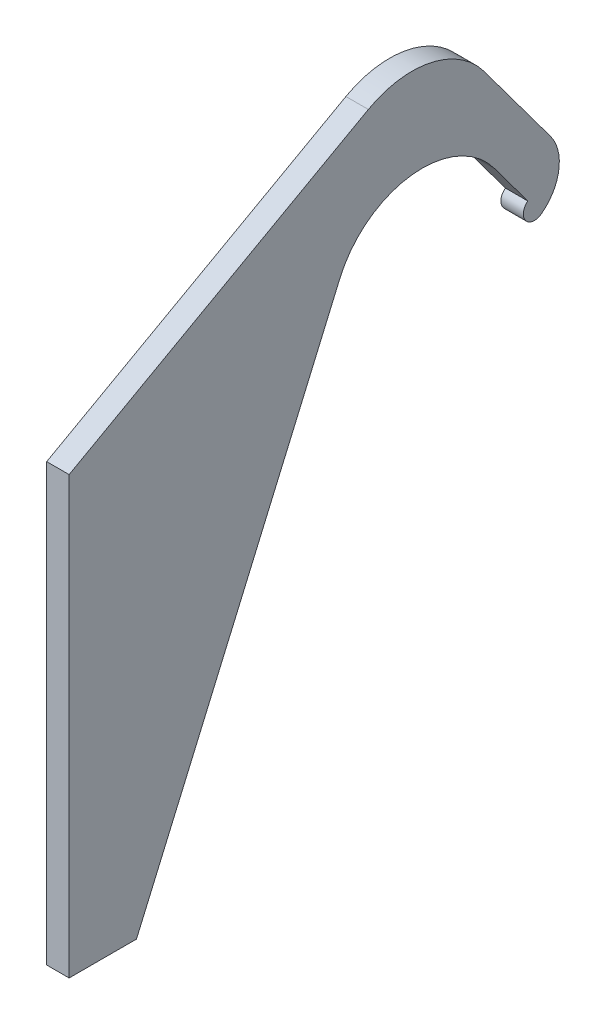
ISO-10303-21;
HEADER;
FILE_DESCRIPTION(('STEP AP214'),'2;1');
FILE_NAME('part.step','',(''),(''),'','','');
FILE_SCHEMA(('AUTOMOTIVE_DESIGN { 1 0 10303 214 1 1 1 1 }'));
ENDSEC;
DATA;
#1=APPLICATION_CONTEXT('core data for automotive mechanical design processes');
#2=APPLICATION_PROTOCOL_DEFINITION('international standard','automotive_design',2000,#1);
#3=PRODUCT_CONTEXT('',#1,'mechanical');
#4=PRODUCT('Part','Part','',(#3));
#5=PRODUCT_RELATED_PRODUCT_CATEGORY('part','',(#4));
#6=PRODUCT_DEFINITION_FORMATION('','',#4);
#7=PRODUCT_DEFINITION_CONTEXT('part definition',#1,'design');
#8=PRODUCT_DEFINITION('design','',#6,#7);
#9=PRODUCT_DEFINITION_SHAPE('','',#8);
#10=(LENGTH_UNIT() NAMED_UNIT(*) SI_UNIT(.MILLI.,.METRE.));
#11=(NAMED_UNIT(*) PLANE_ANGLE_UNIT() SI_UNIT($,.RADIAN.));
#12=(NAMED_UNIT(*) SI_UNIT($,.STERADIAN.) SOLID_ANGLE_UNIT());
#13=UNCERTAINTY_MEASURE_WITH_UNIT(LENGTH_MEASURE(1.E-05),#10,'distance_accuracy_value','');
#14=(GEOMETRIC_REPRESENTATION_CONTEXT(3) GLOBAL_UNCERTAINTY_ASSIGNED_CONTEXT((#13)) GLOBAL_UNIT_ASSIGNED_CONTEXT((#10,
#11,#12)) REPRESENTATION_CONTEXT('',''));
#15=CARTESIAN_POINT('',(0.,0.,0.));
#16=DIRECTION('',(0.,0.,1.));
#17=DIRECTION('',(1.,0.,0.));
#18=AXIS2_PLACEMENT_3D('',#15,#16,#17);
#19=CARTESIAN_POINT('',(3.175,61.6912472529356,0.));
#20=DIRECTION('',(0.,0.,-1.));
#21=DIRECTION('',(-1.,0.,0.));
#22=AXIS2_PLACEMENT_3D('',#19,#20,#21);
#23=PLANE('',#22);
#24=DIRECTION('',(0.,-1.,0.));
#25=VECTOR('',#24,1.);
#26=CARTESIAN_POINT('',(0.,61.6912472529356,0.));
#27=LINE('',#26,#25);
#28=CARTESIAN_POINT('',(0.,61.6912472529356,0.));
#29=VERTEX_POINT('',#28);
#30=CARTESIAN_POINT('',(0.,0.,0.));
#31=VERTEX_POINT('',#30);
#32=EDGE_CURVE('E147',#29,#31,#27,.T.);
#33=ORIENTED_EDGE('',*,*,#32,.T.);
#34=DIRECTION('',(-1.,0.,0.));
#35=VECTOR('',#34,1.);
#36=CARTESIAN_POINT('',(3.175,0.,0.));
#37=LINE('',#36,#35);
#38=CARTESIAN_POINT('',(3.175,0.,0.));
#39=VERTEX_POINT('',#38);
#40=EDGE_CURVE('E11',#39,#31,#37,.T.);
#41=ORIENTED_EDGE('',*,*,#40,.F.);
#42=DIRECTION('',(0.,-1.,0.));
#43=VECTOR('',#42,1.);
#44=CARTESIAN_POINT('',(3.175,61.6912472529356,0.));
#45=LINE('',#44,#43);
#46=CARTESIAN_POINT('',(3.175,61.6912472529356,0.));
#47=VERTEX_POINT('',#46);
#48=EDGE_CURVE('E165',#47,#39,#45,.T.);
#49=ORIENTED_EDGE('',*,*,#48,.F.);
#50=DIRECTION('',(-1.,0.,0.));
#51=VECTOR('',#50,1.);
#52=CARTESIAN_POINT('',(3.175,61.6912472529356,0.));
#53=LINE('',#52,#51);
#54=EDGE_CURVE('E143',#47,#29,#53,.T.);
#55=ORIENTED_EDGE('',*,*,#54,.T.);
#56=EDGE_LOOP('',(#33,#41,#49,#55));
#57=FACE_BOUND('',#56,.T.);
#58=ADVANCED_FACE('F39',(#57),#23,.F.);
#59=CARTESIAN_POINT('',(3.175,0.,0.));
#60=DIRECTION('',(0.,1.,0.));
#61=DIRECTION('',(0.,0.,1.));
#62=AXIS2_PLACEMENT_3D('',#59,#60,#61);
#63=PLANE('',#62);
#64=DIRECTION('',(0.,0.,-1.));
#65=VECTOR('',#64,1.);
#66=CARTESIAN_POINT('',(0.,0.,0.));
#67=LINE('',#66,#65);
#68=CARTESIAN_POINT('',(0.,0.,-9.525));
#69=VERTEX_POINT('',#68);
#70=EDGE_CURVE('E150',#31,#69,#67,.T.);
#71=ORIENTED_EDGE('',*,*,#70,.T.);
#72=DIRECTION('',(-1.,0.,0.));
#73=VECTOR('',#72,1.);
#74=CARTESIAN_POINT('',(3.175,0.,-9.525));
#75=LINE('',#74,#73);
#76=CARTESIAN_POINT('',(3.175,0.,-9.525));
#77=VERTEX_POINT('',#76);
#78=EDGE_CURVE('E47',#77,#69,#75,.T.);
#79=ORIENTED_EDGE('',*,*,#78,.F.);
#80=DIRECTION('',(0.,0.,-1.));
#81=VECTOR('',#80,1.);
#82=CARTESIAN_POINT('',(3.175,0.,0.));
#83=LINE('',#82,#81);
#84=EDGE_CURVE('E104',#39,#77,#83,.T.);
#85=ORIENTED_EDGE('',*,*,#84,.F.);
#86=ORIENTED_EDGE('',*,*,#40,.T.);
#87=EDGE_LOOP('',(#71,#79,#85,#86));
#88=FACE_BOUND('',#87,.T.);
#89=ADVANCED_FACE('F214',(#88),#63,.F.);
#90=CARTESIAN_POINT('',(3.175,0.,-9.525));
#91=DIRECTION('',(0.,0.396901047345091,0.917861404906193));
#92=DIRECTION('',(0.,-0.917861404906193,0.396901047345091));
#93=AXIS2_PLACEMENT_3D('',#90,#91,#92);
#94=PLANE('',#93);
#95=DIRECTION('',(0.,0.917861404906193,-0.396901047345091));
#96=VECTOR('',#95,1.);
#97=CARTESIAN_POINT('',(0.,0.,-9.525));
#98=LINE('',#97,#96);
#99=CARTESIAN_POINT('',(0.,66.5955183780908,-38.3221918761034));
#100=VERTEX_POINT('',#99);
#101=EDGE_CURVE('E152',#69,#100,#98,.T.);
#102=ORIENTED_EDGE('',*,*,#101,.T.);
#103=DIRECTION('',(-1.,0.,0.));
#104=VECTOR('',#103,1.);
#105=CARTESIAN_POINT('',(3.175,66.5955183780908,-38.3221918761034));
#106=LINE('',#105,#104);
#107=CARTESIAN_POINT('',(3.175,66.5955183780908,-38.3221918761034));
#108=VERTEX_POINT('',#107);
#109=EDGE_CURVE('E178',#108,#100,#106,.T.);
#110=ORIENTED_EDGE('',*,*,#109,.F.);
#111=DIRECTION('',(0.,0.917861404906193,-0.396901047345091));
#112=VECTOR('',#111,1.);
#113=CARTESIAN_POINT('',(3.175,0.,-9.525));
#114=LINE('',#113,#112);
#115=EDGE_CURVE('E186',#77,#108,#114,.T.);
#116=ORIENTED_EDGE('',*,*,#115,.F.);
#117=ORIENTED_EDGE('',*,*,#78,.T.);
#118=EDGE_LOOP('',(#102,#110,#116,#117));
#119=FACE_BOUND('',#118,.T.);
#120=ADVANCED_FACE('F184',(#119),#94,.F.);
#121=CARTESIAN_POINT('',(3.175,61.5548750768081,-49.9790317184122));
#122=DIRECTION('',(-1.,0.,0.));
#123=DIRECTION('',(0.,0.,1.));
#124=AXIS2_PLACEMENT_3D('',#121,#122,#123);
#125=CYLINDRICAL_SURFACE('',#124,12.7);
#126=CARTESIAN_POINT('',(0.,61.5548750768081,-49.9790317184122));
#127=DIRECTION('',(-1.,0.,0.));
#128=DIRECTION('',(0.,0.,1.));
#129=AXIS2_PLACEMENT_3D('',#126,#127,#128);
#130=CIRCLE('',#129,12.7);
#131=CARTESIAN_POINT('',(0.,69.1296728574526,-60.1727767898932));
#132=VERTEX_POINT('',#131);
#133=EDGE_CURVE('E154',#100,#132,#130,.T.);
#134=ORIENTED_EDGE('',*,*,#133,.T.);
#135=DIRECTION('',(-1.,0.,0.));
#136=VECTOR('',#135,1.);
#137=CARTESIAN_POINT('',(3.175,69.1296728574526,-60.1727767898932));
#138=LINE('',#137,#136);
#139=CARTESIAN_POINT('',(3.175,69.1296728574526,-60.1727767898932));
#140=VERTEX_POINT('',#139);
#141=EDGE_CURVE('E175',#140,#132,#138,.T.);
#142=ORIENTED_EDGE('',*,*,#141,.F.);
#143=CARTESIAN_POINT('',(3.175,61.5548750768081,-49.9790317184122));
#144=DIRECTION('',(-1.,0.,0.));
#145=DIRECTION('',(0.,0.,1.));
#146=AXIS2_PLACEMENT_3D('',#143,#144,#145);
#147=CIRCLE('',#146,12.7);
#148=EDGE_CURVE('E204',#108,#140,#147,.T.);
#149=ORIENTED_EDGE('',*,*,#148,.F.);
#150=ORIENTED_EDGE('',*,*,#109,.T.);
#151=EDGE_LOOP('',(#134,#142,#149,#150));
#152=FACE_BOUND('',#151,.T.);
#153=ADVANCED_FACE('F195',(#152),#125,.F.);
#154=CARTESIAN_POINT('',(3.175,69.1296728574526,-60.1727767898932));
#155=DIRECTION('',(0.,0.596440770129486,-0.8026570922426));
#156=DIRECTION('',(0.,0.8026570922426,0.596440770129486));
#157=AXIS2_PLACEMENT_3D('',#154,#155,#156);
#158=PLANE('',#157);
#159=DIRECTION('',(0.,-0.8026570922426,-0.596440770129486));
#160=VECTOR('',#159,1.);
#161=CARTESIAN_POINT('',(0.,69.1296728574526,-60.1727767898932));
#162=LINE('',#161,#160);
#163=CARTESIAN_POINT('',(0.,62.758582187777,-64.9070254027959));
#164=VERTEX_POINT('',#163);
#165=EDGE_CURVE('E156',#132,#164,#162,.T.);
#166=ORIENTED_EDGE('',*,*,#165,.T.);
#167=DIRECTION('',(-1.,0.,0.));
#168=VECTOR('',#167,1.);
#169=CARTESIAN_POINT('',(3.175,62.758582187777,-64.9070254027959));
#170=LINE('',#169,#168);
#171=CARTESIAN_POINT('',(3.175,62.758582187777,-64.9070254027959));
#172=VERTEX_POINT('',#171);
#173=EDGE_CURVE('E172',#172,#164,#170,.T.);
#174=ORIENTED_EDGE('',*,*,#173,.F.);
#175=DIRECTION('',(0.,-0.8026570922426,-0.596440770129486));
#176=VECTOR('',#175,1.);
#177=CARTESIAN_POINT('',(3.175,69.1296728574526,-60.1727767898932));
#178=LINE('',#177,#176);
#179=EDGE_CURVE('E201',#140,#172,#178,.T.);
#180=ORIENTED_EDGE('',*,*,#179,.F.);
#181=ORIENTED_EDGE('',*,*,#141,.T.);
#182=EDGE_LOOP('',(#166,#174,#180,#181));
#183=FACE_BOUND('',#182,.T.);
#184=ADVANCED_FACE('F199',(#183),#158,.F.);
#185=CARTESIAN_POINT('',(3.175,61.4843640538419,-65.8538751253764));
#186=DIRECTION('',(-1.,0.,0.));
#187=DIRECTION('',(0.,0.,1.));
#188=AXIS2_PLACEMENT_3D('',#185,#186,#187);
#189=CYLINDRICAL_SURFACE('',#188,1.58750000000001);
#190=CARTESIAN_POINT('',(0.,61.4843640538419,-65.8538751253764));
#191=DIRECTION('',(1.,0.,0.));
#192=DIRECTION('',(0.,0.,-1.));
#193=AXIS2_PLACEMENT_3D('',#190,#191,#192);
#194=CIRCLE('',#193,1.58750000000001);
#195=CARTESIAN_POINT('',(0.,60.2101459199068,-66.800724847957));
#196=VERTEX_POINT('',#195);
#197=EDGE_CURVE('E158',#164,#196,#194,.T.);
#198=ORIENTED_EDGE('',*,*,#197,.T.);
#199=DIRECTION('',(-1.,0.,0.));
#200=VECTOR('',#199,1.);
#201=CARTESIAN_POINT('',(3.175,60.2101459199068,-66.800724847957));
#202=LINE('',#201,#200);
#203=CARTESIAN_POINT('',(3.175,60.2101459199068,-66.800724847957));
#204=VERTEX_POINT('',#203);
#205=EDGE_CURVE('E169',#204,#196,#202,.T.);
#206=ORIENTED_EDGE('',*,*,#205,.F.);
#207=CARTESIAN_POINT('',(3.175,61.4843640538419,-65.8538751253764));
#208=DIRECTION('',(1.,0.,0.));
#209=DIRECTION('',(0.,0.,-1.));
#210=AXIS2_PLACEMENT_3D('',#207,#208,#209);
#211=CIRCLE('',#210,1.58750000000001);
#212=EDGE_CURVE('E203',#172,#204,#211,.T.);
#213=ORIENTED_EDGE('',*,*,#212,.F.);
#214=ORIENTED_EDGE('',*,*,#173,.T.);
#215=EDGE_LOOP('',(#198,#206,#213,#214));
#216=FACE_BOUND('',#215,.T.);
#217=ADVANCED_FACE('F226',(#216),#189,.T.);
#218=CARTESIAN_POINT('',(3.175,65.3070184556472,-63.0133259576348));
#219=DIRECTION('',(-1.,0.,0.));
#220=DIRECTION('',(0.,0.,1.));
#221=AXIS2_PLACEMENT_3D('',#218,#219,#220);
#222=CYLINDRICAL_SURFACE('',#221,6.34999999999995);
#223=CARTESIAN_POINT('',(0.,65.3070184556472,-63.0133259576348));
#224=DIRECTION('',(1.,0.,0.));
#225=DIRECTION('',(0.,0.,-1.));
#226=AXIS2_PLACEMENT_3D('',#223,#224,#225);
#227=CIRCLE('',#226,6.34999999999995);
#228=CARTESIAN_POINT('',(0.,69.0944173459695,-68.1101984933752));
#229=VERTEX_POINT('',#228);
#230=EDGE_CURVE('E160',#196,#229,#227,.T.);
#231=ORIENTED_EDGE('',*,*,#230,.T.);
#232=DIRECTION('',(-1.,0.,0.));
#233=VECTOR('',#232,1.);
#234=CARTESIAN_POINT('',(3.175,69.0944173459695,-68.1101984933752));
#235=LINE('',#234,#233);
#236=CARTESIAN_POINT('',(3.175,69.0944173459695,-68.1101984933752));
#237=VERTEX_POINT('',#236);
#238=EDGE_CURVE('E138',#237,#229,#235,.T.);
#239=ORIENTED_EDGE('',*,*,#238,.F.);
#240=CARTESIAN_POINT('',(3.175,65.3070184556472,-63.0133259576348));
#241=DIRECTION('',(1.,0.,0.));
#242=DIRECTION('',(0.,0.,-1.));
#243=AXIS2_PLACEMENT_3D('',#240,#241,#242);
#244=CIRCLE('',#243,6.34999999999995);
#245=EDGE_CURVE('E129',#204,#237,#244,.T.);
#246=ORIENTED_EDGE('',*,*,#245,.F.);
#247=ORIENTED_EDGE('',*,*,#205,.T.);
#248=EDGE_LOOP('',(#231,#239,#246,#247));
#249=FACE_BOUND('',#248,.T.);
#250=ADVANCED_FACE('F229',(#249),#222,.T.);
#251=CARTESIAN_POINT('',(3.175,69.0944173459695,-68.1101984933753));
#252=DIRECTION('',(0.,-0.59644077012949,0.802657092242597));
#253=DIRECTION('',(0.,-0.802657092242597,-0.59644077012949));
#254=AXIS2_PLACEMENT_3D('',#251,#252,#253);
#255=PLANE('',#254);
#256=DIRECTION('',(0.,0.802657092242597,0.59644077012949));
#257=VECTOR('',#256,1.);
#258=CARTESIAN_POINT('',(0.,69.0944173459695,-68.1101984933753));
#259=LINE('',#258,#257);
#260=CARTESIAN_POINT('',(0.,81.7451139393799,-58.7096820190655));
#261=VERTEX_POINT('',#260);
#262=EDGE_CURVE('E137',#229,#261,#259,.T.);
#263=ORIENTED_EDGE('',*,*,#262,.T.);
#264=DIRECTION('',(-1.,0.,0.));
#265=VECTOR('',#264,1.);
#266=CARTESIAN_POINT('',(3.175,81.7451139393799,-58.7096820190655));
#267=LINE('',#266,#265);
#268=CARTESIAN_POINT('',(3.175,81.7451139393799,-58.7096820190655));
#269=VERTEX_POINT('',#268);
#270=EDGE_CURVE('E134',#269,#261,#267,.T.);
#271=ORIENTED_EDGE('',*,*,#270,.F.);
#272=DIRECTION('',(0.,0.802657092242597,0.59644077012949));
#273=VECTOR('',#272,1.);
#274=CARTESIAN_POINT('',(3.175,69.0944173459695,-68.1101984933753));
#275=LINE('',#274,#273);
#276=EDGE_CURVE('E123',#237,#269,#275,.T.);
#277=ORIENTED_EDGE('',*,*,#276,.F.);
#278=ORIENTED_EDGE('',*,*,#238,.T.);
#279=EDGE_LOOP('',(#263,#271,#277,#278));
#280=FACE_BOUND('',#279,.T.);
#281=ADVANCED_FACE('F135',(#280),#255,.F.);
#282=CARTESIAN_POINT('',(3.175,74.1703161587353,-48.5159369475844));
#283=DIRECTION('',(-1.,0.,0.));
#284=DIRECTION('',(0.,0.,1.));
#285=AXIS2_PLACEMENT_3D('',#282,#283,#284);
#286=CYLINDRICAL_SURFACE('',#285,12.7);
#287=CARTESIAN_POINT('',(0.,74.1703161587353,-48.5159369475844));
#288=DIRECTION('',(1.,0.,0.));
#289=DIRECTION('',(0.,0.,-1.));
#290=AXIS2_PLACEMENT_3D('',#287,#288,#289);
#291=CIRCLE('',#290,12.7);
#292=CARTESIAN_POINT('',(0.,85.266095591343,-42.3374517948208));
#293=VERTEX_POINT('',#292);
#294=EDGE_CURVE('E90',#261,#293,#291,.T.);
#295=ORIENTED_EDGE('',*,*,#294,.T.);
#296=DIRECTION('',(-1.,0.,0.));
#297=VECTOR('',#296,1.);
#298=CARTESIAN_POINT('',(3.175,85.266095591343,-42.3374517948208));
#299=LINE('',#298,#297);
#300=CARTESIAN_POINT('',(3.175,85.266095591343,-42.3374517948208));
#301=VERTEX_POINT('',#300);
#302=EDGE_CURVE('E139',#301,#293,#299,.T.);
#303=ORIENTED_EDGE('',*,*,#302,.F.);
#304=CARTESIAN_POINT('',(3.175,74.1703161587353,-48.5159369475844));
#305=DIRECTION('',(1.,0.,0.));
#306=DIRECTION('',(0.,0.,-1.));
#307=AXIS2_PLACEMENT_3D('',#304,#305,#306);
#308=CIRCLE('',#307,12.7);
#309=EDGE_CURVE('E127',#269,#301,#308,.T.);
#310=ORIENTED_EDGE('',*,*,#309,.F.);
#311=ORIENTED_EDGE('',*,*,#270,.T.);
#312=EDGE_LOOP('',(#295,#303,#310,#311));
#313=FACE_BOUND('',#312,.T.);
#314=ADVANCED_FACE('F141',(#313),#286,.T.);
#315=CARTESIAN_POINT('',(3.175,85.266095591343,-42.3374517948208));
#316=DIRECTION('',(0.,-0.873683419890367,-0.486494893918397));
#317=DIRECTION('',(0.,0.486494893918397,-0.873683419890367));
#318=AXIS2_PLACEMENT_3D('',#315,#316,#317);
#319=PLANE('',#318);
#320=DIRECTION('',(0.,-0.486494893918397,0.873683419890367));
#321=VECTOR('',#320,1.);
#322=CARTESIAN_POINT('',(0.,85.266095591343,-42.3374517948208));
#323=LINE('',#322,#321);
#324=EDGE_CURVE('E96',#293,#29,#323,.T.);
#325=ORIENTED_EDGE('',*,*,#324,.T.);
#326=ORIENTED_EDGE('',*,*,#54,.F.);
#327=DIRECTION('',(0.,-0.486494893918397,0.873683419890367));
#328=VECTOR('',#327,1.);
#329=CARTESIAN_POINT('',(3.175,85.266095591343,-42.3374517948208));
#330=LINE('',#329,#328);
#331=EDGE_CURVE('E55',#301,#47,#330,.T.);
#332=ORIENTED_EDGE('',*,*,#331,.F.);
#333=ORIENTED_EDGE('',*,*,#302,.T.);
#334=EDGE_LOOP('',(#325,#326,#332,#333));
#335=FACE_BOUND('',#334,.T.);
#336=ADVANCED_FACE('F238',(#335),#319,.F.);
#337=CARTESIAN_POINT('',(3.175,61.5548750768081,-49.9790317184122));
#338=DIRECTION('',(-1.,0.,0.));
#339=DIRECTION('',(0.,0.,1.));
#340=AXIS2_PLACEMENT_3D('',#337,#338,#339);
#341=PLANE('',#340);
#342=ORIENTED_EDGE('',*,*,#48,.T.);
#343=ORIENTED_EDGE('',*,*,#84,.T.);
#344=ORIENTED_EDGE('',*,*,#115,.T.);
#345=ORIENTED_EDGE('',*,*,#148,.T.);
#346=ORIENTED_EDGE('',*,*,#179,.T.);
#347=ORIENTED_EDGE('',*,*,#212,.T.);
#348=ORIENTED_EDGE('',*,*,#245,.T.);
#349=ORIENTED_EDGE('',*,*,#276,.T.);
#350=ORIENTED_EDGE('',*,*,#309,.T.);
#351=ORIENTED_EDGE('',*,*,#331,.T.);
#352=EDGE_LOOP('',(#342,#343,#344,#345,#346,#347,#348,#349,#350,#351));
#353=FACE_BOUND('',#352,.T.);
#354=ADVANCED_FACE('F125',(#353),#341,.F.);
#355=CARTESIAN_POINT('',(0.,61.5548750768081,-49.9790317184122));
#356=DIRECTION('',(-1.,0.,0.));
#357=DIRECTION('',(0.,0.,1.));
#358=AXIS2_PLACEMENT_3D('',#355,#356,#357);
#359=PLANE('',#358);
#360=ORIENTED_EDGE('',*,*,#32,.F.);
#361=ORIENTED_EDGE('',*,*,#324,.F.);
#362=ORIENTED_EDGE('',*,*,#294,.F.);
#363=ORIENTED_EDGE('',*,*,#262,.F.);
#364=ORIENTED_EDGE('',*,*,#230,.F.);
#365=ORIENTED_EDGE('',*,*,#197,.F.);
#366=ORIENTED_EDGE('',*,*,#165,.F.);
#367=ORIENTED_EDGE('',*,*,#133,.F.);
#368=ORIENTED_EDGE('',*,*,#101,.F.);
#369=ORIENTED_EDGE('',*,*,#70,.F.);
#370=EDGE_LOOP('',(#360,#361,#362,#363,#364,#365,#366,#367,#368,#369));
#371=FACE_BOUND('',#370,.T.);
#372=ADVANCED_FACE('F190',(#371),#359,.T.);
#373=CLOSED_SHELL('',(#58,#89,#120,#153,#184,#217,#250,#281,#314,#336,#354,#372));
#374=MANIFOLD_SOLID_BREP('B2',#373);
#375=ADVANCED_BREP_SHAPE_REPRESENTATION('',(#18,#374),#14);
#376=SHAPE_DEFINITION_REPRESENTATION(#9,#375);
ENDSEC;
END-ISO-10303-21;
